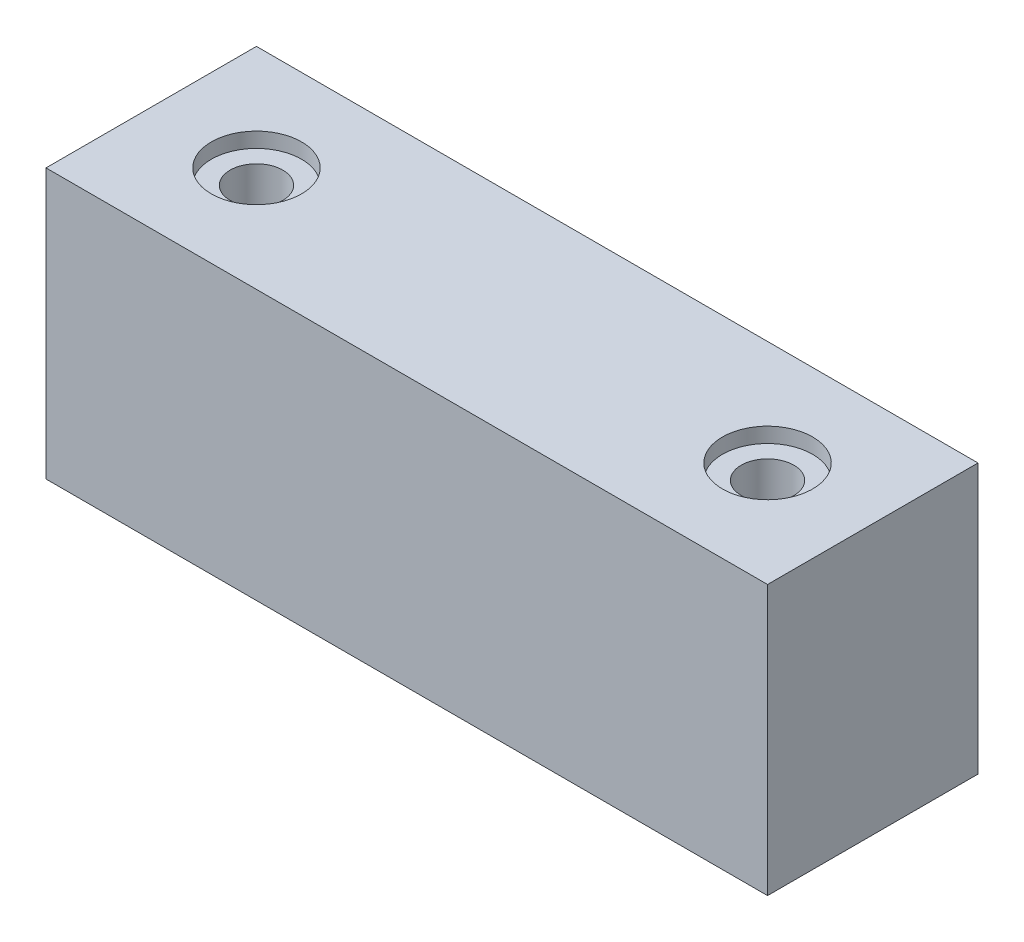
ISO-10303-21;
HEADER;
FILE_DESCRIPTION(('STEP AP214'),'2;1');
FILE_NAME('part.step','',(''),(''),'','','');
FILE_SCHEMA(('AUTOMOTIVE_DESIGN { 1 0 10303 214 1 1 1 1 }'));
ENDSEC;
DATA;
#1=APPLICATION_CONTEXT('core data for automotive mechanical design processes');
#2=APPLICATION_PROTOCOL_DEFINITION('international standard','automotive_design',2000,#1);
#3=PRODUCT_CONTEXT('',#1,'mechanical');
#4=PRODUCT('Part','Part','',(#3));
#5=PRODUCT_RELATED_PRODUCT_CATEGORY('part','',(#4));
#6=PRODUCT_DEFINITION_FORMATION('','',#4);
#7=PRODUCT_DEFINITION_CONTEXT('part definition',#1,'design');
#8=PRODUCT_DEFINITION('design','',#6,#7);
#9=PRODUCT_DEFINITION_SHAPE('','',#8);
#10=(LENGTH_UNIT() NAMED_UNIT(*) SI_UNIT(.MILLI.,.METRE.));
#11=(NAMED_UNIT(*) PLANE_ANGLE_UNIT() SI_UNIT($,.RADIAN.));
#12=(NAMED_UNIT(*) SI_UNIT($,.STERADIAN.) SOLID_ANGLE_UNIT());
#13=UNCERTAINTY_MEASURE_WITH_UNIT(LENGTH_MEASURE(1.E-05),#10,'distance_accuracy_value','');
#14=(GEOMETRIC_REPRESENTATION_CONTEXT(3) GLOBAL_UNCERTAINTY_ASSIGNED_CONTEXT((#13)) GLOBAL_UNIT_ASSIGNED_CONTEXT((#10,
#11,#12)) REPRESENTATION_CONTEXT('',''));
#15=CARTESIAN_POINT('',(0.,0.,0.));
#16=DIRECTION('',(0.,0.,1.));
#17=DIRECTION('',(1.,0.,0.));
#18=AXIS2_PLACEMENT_3D('',#15,#16,#17);
#19=CARTESIAN_POINT('',(-128.226206896552,-133.481379310345,88.9));
#20=DIRECTION('',(0.,1.,0.));
#21=DIRECTION('',(0.,0.,1.));
#22=AXIS2_PLACEMENT_3D('',#19,#20,#21);
#23=PLANE('',#22);
#24=CARTESIAN_POINT('',(-83.776206896552,-133.481379310345,44.45));
#25=DIRECTION('',(0.,1.,0.));
#26=DIRECTION('',(0.,0.,1.));
#27=AXIS2_PLACEMENT_3D('',#24,#25,#26);
#28=CIRCLE('',#27,11.1125);
#29=CARTESIAN_POINT('',(-83.776206896552,-133.481379310345,55.5625));
#30=VERTEX_POINT('',#29);
#31=EDGE_CURVE('E140',#30,#30,#28,.T.);
#32=ORIENTED_EDGE('',*,*,#31,.T.);
#33=EDGE_LOOP('',(#32));
#34=FACE_BOUND('',#33,.T.);
#35=CARTESIAN_POINT('',(132.123793103448,-133.481379310345,44.45));
#36=DIRECTION('',(0.,1.,0.));
#37=DIRECTION('',(0.,0.,-1.));
#38=AXIS2_PLACEMENT_3D('',#35,#36,#37);
#39=CIRCLE('',#38,11.1125);
#40=CARTESIAN_POINT('',(132.123793103448,-133.481379310345,55.5625));
#41=VERTEX_POINT('',#40);
#42=EDGE_CURVE('E143',#41,#41,#39,.T.);
#43=ORIENTED_EDGE('',*,*,#42,.T.);
#44=EDGE_LOOP('',(#43));
#45=FACE_BOUND('',#44,.T.);
#46=DIRECTION('',(1.,0.,0.));
#47=VECTOR('',#46,1.);
#48=CARTESIAN_POINT('',(-128.226206896552,-133.481379310345,0.));
#49=LINE('',#48,#47);
#50=CARTESIAN_POINT('',(-128.226206896552,-133.481379310345,0.));
#51=VERTEX_POINT('',#50);
#52=CARTESIAN_POINT('',(176.573793103448,-133.481379310345,0.));
#53=VERTEX_POINT('',#52);
#54=EDGE_CURVE('E101',#51,#53,#49,.T.);
#55=ORIENTED_EDGE('',*,*,#54,.T.);
#56=DIRECTION('',(0.,0.,-1.));
#57=VECTOR('',#56,1.);
#58=CARTESIAN_POINT('',(176.573793103448,-133.481379310345,88.9));
#59=LINE('',#58,#57);
#60=CARTESIAN_POINT('',(176.573793103448,-133.481379310345,88.9));
#61=VERTEX_POINT('',#60);
#62=EDGE_CURVE('E11',#61,#53,#59,.T.);
#63=ORIENTED_EDGE('',*,*,#62,.F.);
#64=DIRECTION('',(1.,0.,0.));
#65=VECTOR('',#64,1.);
#66=CARTESIAN_POINT('',(-128.226206896552,-133.481379310345,88.9));
#67=LINE('',#66,#65);
#68=CARTESIAN_POINT('',(-128.226206896552,-133.481379310345,88.9));
#69=VERTEX_POINT('',#68);
#70=EDGE_CURVE('E76',#69,#61,#67,.T.);
#71=ORIENTED_EDGE('',*,*,#70,.F.);
#72=DIRECTION('',(0.,0.,-1.));
#73=VECTOR('',#72,1.);
#74=CARTESIAN_POINT('',(-128.226206896552,-133.481379310345,88.9));
#75=LINE('',#74,#73);
#76=EDGE_CURVE('E100',#69,#51,#75,.T.);
#77=ORIENTED_EDGE('',*,*,#76,.T.);
#78=EDGE_LOOP('',(#55,#63,#71,#77));
#79=FACE_BOUND('',#78,.T.);
#80=ADVANCED_FACE('F39',(#34,#45,#79),#23,.F.);
#81=CARTESIAN_POINT('',(176.573793103448,-19.6504734474081,88.9));
#82=DIRECTION('',(1.,0.,0.));
#83=DIRECTION('',(0.,0.,-1.));
#84=AXIS2_PLACEMENT_3D('',#81,#82,#83);
#85=PLANE('',#84);
#86=DIRECTION('',(0.,-1.,0.));
#87=VECTOR('',#86,1.);
#88=CARTESIAN_POINT('',(176.573793103448,-19.6504734474081,0.));
#89=LINE('',#88,#87);
#90=CARTESIAN_POINT('',(176.573793103448,-19.6504734474081,0.));
#91=VERTEX_POINT('',#90);
#92=EDGE_CURVE('E87',#91,#53,#89,.T.);
#93=ORIENTED_EDGE('',*,*,#92,.F.);
#94=DIRECTION('',(0.,0.,-1.));
#95=VECTOR('',#94,1.);
#96=CARTESIAN_POINT('',(176.573793103448,-19.6504734474081,88.9));
#97=LINE('',#96,#95);
#98=CARTESIAN_POINT('',(176.573793103448,-19.6504734474081,88.9));
#99=VERTEX_POINT('',#98);
#100=EDGE_CURVE('E50',#99,#91,#97,.T.);
#101=ORIENTED_EDGE('',*,*,#100,.F.);
#102=DIRECTION('',(0.,-1.,0.));
#103=VECTOR('',#102,1.);
#104=CARTESIAN_POINT('',(176.573793103448,-19.6504734474081,88.9));
#105=LINE('',#104,#103);
#106=EDGE_CURVE('E83',#99,#61,#105,.T.);
#107=ORIENTED_EDGE('',*,*,#106,.T.);
#108=ORIENTED_EDGE('',*,*,#62,.T.);
#109=EDGE_LOOP('',(#93,#101,#107,#108));
#110=FACE_BOUND('',#109,.T.);
#111=ADVANCED_FACE('F81',(#110),#85,.T.);
#112=CARTESIAN_POINT('',(-128.226206896552,-19.6504734474081,88.9));
#113=DIRECTION('',(0.,1.,0.));
#114=DIRECTION('',(0.,0.,1.));
#115=AXIS2_PLACEMENT_3D('',#112,#113,#114);
#116=PLANE('',#115);
#117=CARTESIAN_POINT('',(-83.776206896552,-19.6504734474081,44.45));
#118=DIRECTION('',(0.,1.,0.));
#119=DIRECTION('',(0.,0.,1.));
#120=AXIS2_PLACEMENT_3D('',#117,#118,#119);
#121=CIRCLE('',#120,19.05);
#122=CARTESIAN_POINT('',(-83.776206896552,-19.6504734474081,63.5));
#123=VERTEX_POINT('',#122);
#124=EDGE_CURVE('E155',#123,#123,#121,.T.);
#125=ORIENTED_EDGE('',*,*,#124,.F.);
#126=EDGE_LOOP('',(#125));
#127=FACE_BOUND('',#126,.T.);
#128=CARTESIAN_POINT('',(132.123793103448,-19.6504734474081,44.45));
#129=DIRECTION('',(0.,1.,0.));
#130=DIRECTION('',(0.,0.,-1.));
#131=AXIS2_PLACEMENT_3D('',#128,#129,#130);
#132=CIRCLE('',#131,19.05);
#133=CARTESIAN_POINT('',(132.123793103448,-19.6504734474081,25.4));
#134=VERTEX_POINT('',#133);
#135=EDGE_CURVE('E154',#134,#134,#132,.T.);
#136=ORIENTED_EDGE('',*,*,#135,.F.);
#137=EDGE_LOOP('',(#136));
#138=FACE_BOUND('',#137,.T.);
#139=DIRECTION('',(1.,0.,0.));
#140=VECTOR('',#139,1.);
#141=CARTESIAN_POINT('',(-128.226206896552,-19.6504734474081,0.));
#142=LINE('',#141,#140);
#143=CARTESIAN_POINT('',(-128.226206896552,-19.6504734474081,0.));
#144=VERTEX_POINT('',#143);
#145=EDGE_CURVE('E106',#144,#91,#142,.T.);
#146=ORIENTED_EDGE('',*,*,#145,.F.);
#147=DIRECTION('',(0.,0.,-1.));
#148=VECTOR('',#147,1.);
#149=CARTESIAN_POINT('',(-128.226206896552,-19.6504734474081,88.9));
#150=LINE('',#149,#148);
#151=CARTESIAN_POINT('',(-128.226206896552,-19.6504734474081,88.9));
#152=VERTEX_POINT('',#151);
#153=EDGE_CURVE('E68',#152,#144,#150,.T.);
#154=ORIENTED_EDGE('',*,*,#153,.F.);
#155=DIRECTION('',(1.,0.,0.));
#156=VECTOR('',#155,1.);
#157=CARTESIAN_POINT('',(-128.226206896552,-19.6504734474081,88.9));
#158=LINE('',#157,#156);
#159=EDGE_CURVE('E91',#152,#99,#158,.T.);
#160=ORIENTED_EDGE('',*,*,#159,.T.);
#161=ORIENTED_EDGE('',*,*,#100,.T.);
#162=EDGE_LOOP('',(#146,#154,#160,#161));
#163=FACE_BOUND('',#162,.T.);
#164=ADVANCED_FACE('F92',(#127,#138,#163),#116,.T.);
#165=CARTESIAN_POINT('',(-128.226206896552,-19.6504734474081,88.9));
#166=DIRECTION('',(1.,0.,0.));
#167=DIRECTION('',(0.,1.,0.));
#168=AXIS2_PLACEMENT_3D('',#165,#166,#167);
#169=PLANE('',#168);
#170=DIRECTION('',(0.,-1.,0.));
#171=VECTOR('',#170,1.);
#172=CARTESIAN_POINT('',(-128.226206896552,-19.6504734474081,0.));
#173=LINE('',#172,#171);
#174=EDGE_CURVE('E71',#144,#51,#173,.T.);
#175=ORIENTED_EDGE('',*,*,#174,.T.);
#176=ORIENTED_EDGE('',*,*,#76,.F.);
#177=DIRECTION('',(0.,-1.,0.));
#178=VECTOR('',#177,1.);
#179=CARTESIAN_POINT('',(-128.226206896552,-19.6504734474081,88.9));
#180=LINE('',#179,#178);
#181=EDGE_CURVE('E54',#152,#69,#180,.T.);
#182=ORIENTED_EDGE('',*,*,#181,.F.);
#183=ORIENTED_EDGE('',*,*,#153,.T.);
#184=EDGE_LOOP('',(#175,#176,#182,#183));
#185=FACE_BOUND('',#184,.T.);
#186=ADVANCED_FACE('F123',(#185),#169,.F.);
#187=CARTESIAN_POINT('',(0.,0.,88.9));
#188=DIRECTION('',(0.,0.,-1.));
#189=DIRECTION('',(-1.,0.,0.));
#190=AXIS2_PLACEMENT_3D('',#187,#188,#189);
#191=PLANE('',#190);
#192=ORIENTED_EDGE('',*,*,#70,.T.);
#193=ORIENTED_EDGE('',*,*,#106,.F.);
#194=ORIENTED_EDGE('',*,*,#159,.F.);
#195=ORIENTED_EDGE('',*,*,#181,.T.);
#196=EDGE_LOOP('',(#192,#193,#194,#195));
#197=FACE_BOUND('',#196,.T.);
#198=ADVANCED_FACE('F95',(#197),#191,.F.);
#199=CARTESIAN_POINT('',(0.,0.,0.));
#200=DIRECTION('',(0.,0.,-1.));
#201=DIRECTION('',(-1.,0.,0.));
#202=AXIS2_PLACEMENT_3D('',#199,#200,#201);
#203=PLANE('',#202);
#204=ORIENTED_EDGE('',*,*,#54,.F.);
#205=ORIENTED_EDGE('',*,*,#174,.F.);
#206=ORIENTED_EDGE('',*,*,#145,.T.);
#207=ORIENTED_EDGE('',*,*,#92,.T.);
#208=EDGE_LOOP('',(#204,#205,#206,#207));
#209=FACE_BOUND('',#208,.T.);
#210=ADVANCED_FACE('F114',(#209),#203,.T.);
#211=CARTESIAN_POINT('',(132.123793103448,-26.0004734474081,44.45));
#212=DIRECTION('',(0.,1.,0.));
#213=DIRECTION('',(0.,0.,1.));
#214=AXIS2_PLACEMENT_3D('',#211,#212,#213);
#215=CYLINDRICAL_SURFACE('',#214,19.05);
#216=CARTESIAN_POINT('',(132.123793103448,-26.0004734474081,44.45));
#217=DIRECTION('',(0.,1.,0.));
#218=DIRECTION('',(0.,0.,-1.));
#219=AXIS2_PLACEMENT_3D('',#216,#217,#218);
#220=CIRCLE('',#219,19.05);
#221=CARTESIAN_POINT('',(132.123793103448,-26.0004734474081,25.4));
#222=VERTEX_POINT('',#221);
#223=EDGE_CURVE('E158',#222,#222,#220,.T.);
#224=ORIENTED_EDGE('',*,*,#223,.F.);
#225=EDGE_LOOP('',(#224));
#226=FACE_BOUND('',#225,.T.);
#227=ORIENTED_EDGE('',*,*,#135,.T.);
#228=EDGE_LOOP('',(#227));
#229=FACE_BOUND('',#228,.T.);
#230=ADVANCED_FACE('F113',(#226,#229),#215,.F.);
#231=CARTESIAN_POINT('',(132.123793103448,-26.0004734474081,44.45));
#232=DIRECTION('',(0.,-1.,0.));
#233=DIRECTION('',(0.,0.,-1.));
#234=AXIS2_PLACEMENT_3D('',#231,#232,#233);
#235=PLANE('',#234);
#236=CARTESIAN_POINT('',(132.123793103448,-26.0004734474081,44.45));
#237=DIRECTION('',(0.,1.,0.));
#238=DIRECTION('',(0.,0.,-1.));
#239=AXIS2_PLACEMENT_3D('',#236,#237,#238);
#240=CIRCLE('',#239,11.1125);
#241=CARTESIAN_POINT('',(132.123793103448,-26.0004734474081,55.5625));
#242=VERTEX_POINT('',#241);
#243=EDGE_CURVE('E141',#242,#242,#240,.T.);
#244=ORIENTED_EDGE('',*,*,#243,.F.);
#245=EDGE_LOOP('',(#244));
#246=FACE_BOUND('',#245,.T.);
#247=ORIENTED_EDGE('',*,*,#223,.T.);
#248=EDGE_LOOP('',(#247));
#249=FACE_BOUND('',#248,.T.);
#250=ADVANCED_FACE('F124',(#246,#249),#235,.F.);
#251=CARTESIAN_POINT('',(-83.776206896552,-26.0004734474081,44.45));
#252=DIRECTION('',(0.,1.,0.));
#253=DIRECTION('',(0.,0.,1.));
#254=AXIS2_PLACEMENT_3D('',#251,#252,#253);
#255=CYLINDRICAL_SURFACE('',#254,19.05);
#256=CARTESIAN_POINT('',(-83.776206896552,-26.0004734474081,44.45));
#257=DIRECTION('',(0.,1.,0.));
#258=DIRECTION('',(0.,0.,1.));
#259=AXIS2_PLACEMENT_3D('',#256,#257,#258);
#260=CIRCLE('',#259,19.05);
#261=CARTESIAN_POINT('',(-83.776206896552,-26.0004734474081,63.5));
#262=VERTEX_POINT('',#261);
#263=EDGE_CURVE('E102',#262,#262,#260,.T.);
#264=ORIENTED_EDGE('',*,*,#263,.F.);
#265=EDGE_LOOP('',(#264));
#266=FACE_BOUND('',#265,.T.);
#267=ORIENTED_EDGE('',*,*,#124,.T.);
#268=EDGE_LOOP('',(#267));
#269=FACE_BOUND('',#268,.T.);
#270=ADVANCED_FACE('F175',(#266,#269),#255,.F.);
#271=CARTESIAN_POINT('',(-83.776206896552,-26.0004734474081,44.45));
#272=DIRECTION('',(0.,1.,0.));
#273=DIRECTION('',(0.,0.,1.));
#274=AXIS2_PLACEMENT_3D('',#271,#272,#273);
#275=PLANE('',#274);
#276=CARTESIAN_POINT('',(-83.776206896552,-26.0004734474081,44.45));
#277=DIRECTION('',(0.,1.,0.));
#278=DIRECTION('',(0.,0.,1.));
#279=AXIS2_PLACEMENT_3D('',#276,#277,#278);
#280=CIRCLE('',#279,11.1125);
#281=CARTESIAN_POINT('',(-83.776206896552,-26.0004734474081,55.5625));
#282=VERTEX_POINT('',#281);
#283=EDGE_CURVE('E148',#282,#282,#280,.T.);
#284=ORIENTED_EDGE('',*,*,#283,.F.);
#285=EDGE_LOOP('',(#284));
#286=FACE_BOUND('',#285,.T.);
#287=ORIENTED_EDGE('',*,*,#263,.T.);
#288=EDGE_LOOP('',(#287));
#289=FACE_BOUND('',#288,.T.);
#290=ADVANCED_FACE('F169',(#286,#289),#275,.T.);
#291=CARTESIAN_POINT('',(132.123793103448,-133.481379310345,44.45));
#292=DIRECTION('',(0.,1.,0.));
#293=DIRECTION('',(0.,0.,1.));
#294=AXIS2_PLACEMENT_3D('',#291,#292,#293);
#295=CYLINDRICAL_SURFACE('',#294,11.1125);
#296=CARTESIAN_POINT('',(132.123793103448,-133.481379310345,55.5625));
#297=CARTESIAN_POINT('',(132.123793103448,-132.361786540939,55.5625));
#298=CARTESIAN_POINT('',(132.123793103448,-131.242193771534,55.5625));
#299=CARTESIAN_POINT('',(132.123793103448,-129.003008232722,55.5625));
#300=CARTESIAN_POINT('',(132.123793103448,-127.883415463317,55.5625));
#301=CARTESIAN_POINT('',(132.123793103448,-125.644229924506,55.5625));
#302=CARTESIAN_POINT('',(132.123793103448,-124.5246371551,55.5625));
#303=CARTESIAN_POINT('',(132.123793103448,-122.285451616289,55.5625));
#304=CARTESIAN_POINT('',(132.123793103448,-121.165858846883,55.5625));
#305=CARTESIAN_POINT('',(132.123793103448,-118.926673308072,55.5625));
#306=CARTESIAN_POINT('',(132.123793103448,-117.807080538667,55.5625));
#307=CARTESIAN_POINT('',(132.123793103448,-115.567894999855,55.5625));
#308=CARTESIAN_POINT('',(132.123793103448,-114.44830223045,55.5625));
#309=CARTESIAN_POINT('',(132.123793103448,-112.209116691639,55.5625));
#310=CARTESIAN_POINT('',(132.123793103448,-111.089523922233,55.5625));
#311=CARTESIAN_POINT('',(132.123793103448,-108.850338383422,55.5625));
#312=CARTESIAN_POINT('',(132.123793103448,-107.730745614016,55.5625));
#313=CARTESIAN_POINT('',(132.123793103448,-105.491560075205,55.5625));
#314=CARTESIAN_POINT('',(132.123793103448,-104.371967305799,55.5625));
#315=CARTESIAN_POINT('',(132.123793103448,-102.132781766988,55.5625));
#316=CARTESIAN_POINT('',(132.123793103448,-101.013188997583,55.5625));
#317=CARTESIAN_POINT('',(132.123793103448,-98.7740034587715,55.5625));
#318=CARTESIAN_POINT('',(132.123793103448,-97.6544106893659,55.5625));
#319=CARTESIAN_POINT('',(132.123793103448,-95.4152251505547,55.5625));
#320=CARTESIAN_POINT('',(132.123793103448,-94.2956323811491,55.5625));
#321=CARTESIAN_POINT('',(132.123793103448,-92.056446842338,55.5625));
#322=CARTESIAN_POINT('',(132.123793103448,-90.9368540729324,55.5625));
#323=CARTESIAN_POINT('',(132.123793103448,-88.6976685341212,55.5625));
#324=CARTESIAN_POINT('',(132.123793103448,-87.5780757647156,55.5625));
#325=CARTESIAN_POINT('',(132.123793103448,-85.3388902259044,55.5625));
#326=CARTESIAN_POINT('',(132.123793103448,-84.2192974564988,55.5625));
#327=CARTESIAN_POINT('',(132.123793103448,-81.9801119176877,55.5625));
#328=CARTESIAN_POINT('',(132.123793103448,-80.8605191482821,55.5625));
#329=CARTESIAN_POINT('',(132.123793103448,-78.6213336094709,55.5625));
#330=CARTESIAN_POINT('',(132.123793103448,-77.5017408400653,55.5625));
#331=CARTESIAN_POINT('',(132.123793103448,-75.2625553012541,55.5625));
#332=CARTESIAN_POINT('',(132.123793103448,-74.1429625318485,55.5625));
#333=CARTESIAN_POINT('',(132.123793103448,-71.9037769930374,55.5625));
#334=CARTESIAN_POINT('',(132.123793103448,-70.7841842236318,55.5625));
#335=CARTESIAN_POINT('',(132.123793103448,-68.5449986848206,55.5625));
#336=CARTESIAN_POINT('',(132.123793103448,-67.425405915415,55.5625));
#337=CARTESIAN_POINT('',(132.123793103448,-65.1862203766038,55.5625));
#338=CARTESIAN_POINT('',(132.123793103448,-64.0666276071982,55.5625));
#339=CARTESIAN_POINT('',(132.123793103448,-61.827442068387,55.5625));
#340=CARTESIAN_POINT('',(132.123793103448,-60.7078492989815,55.5625));
#341=CARTESIAN_POINT('',(132.123793103448,-58.4686637601703,55.5625));
#342=CARTESIAN_POINT('',(132.123793103448,-57.3490709907647,55.5625));
#343=CARTESIAN_POINT('',(132.123793103448,-55.1098854519535,55.5625));
#344=CARTESIAN_POINT('',(132.123793103448,-53.9902926825479,55.5625));
#345=CARTESIAN_POINT('',(132.123793103448,-51.7511071437367,55.5625));
#346=CARTESIAN_POINT('',(132.123793103448,-50.6315143743311,55.5625));
#347=CARTESIAN_POINT('',(132.123793103448,-48.3923288355199,55.5625));
#348=CARTESIAN_POINT('',(132.123793103448,-47.2727360661144,55.5625));
#349=CARTESIAN_POINT('',(132.123793103448,-45.0335505273032,55.5625));
#350=CARTESIAN_POINT('',(132.123793103448,-43.9139577578976,55.5625));
#351=CARTESIAN_POINT('',(132.123793103448,-41.6747722190864,55.5625));
#352=CARTESIAN_POINT('',(132.123793103448,-40.5551794496808,55.5625));
#353=CARTESIAN_POINT('',(132.123793103448,-38.3159939108696,55.5625));
#354=CARTESIAN_POINT('',(132.123793103448,-37.196401141464,55.5625));
#355=CARTESIAN_POINT('',(132.123793103448,-34.9572156026529,55.5625));
#356=CARTESIAN_POINT('',(132.123793103448,-33.8376228332473,55.5625));
#357=CARTESIAN_POINT('',(132.123793103448,-31.5984372944361,55.5625));
#358=CARTESIAN_POINT('',(132.123793103448,-30.4788445250305,55.5625));
#359=CARTESIAN_POINT('',(132.123793103448,-28.2396589862193,55.5625));
#360=CARTESIAN_POINT('',(132.123793103448,-27.1200662168137,55.5625));
#361=CARTESIAN_POINT('',(132.123793103448,-26.0004734474081,55.5625));
#362=B_SPLINE_CURVE_WITH_KNOTS('',3,(#296,#297,#298,#299,#300,#301,#302,#303,#304,#305,#306,
#307,#308,#309,#310,#311,#312,#313,#314,#315,#316,#317,#318,#319,#320,#321,#322,#323,#324,#325,
#326,#327,#328,#329,#330,#331,#332,#333,#334,#335,#336,#337,#338,#339,#340,#341,#342,#343,#344,
#345,#346,#347,#348,#349,#350,#351,#352,#353,#354,#355,#356,#357,#358,#359,#360,#361),
.UNSPECIFIED.,.F.,.F.,(4,2,2,2,2,2,2,2,2,2,2,2,2,2,2,2,2,2,2,2,2,2,2,2,2,2,2,2,2,2,2,2,4),(0.,
3.35877830821676,6.71755661643353,10.0763349246503,13.4351132328671,16.7938915410838,
20.1526698493006,23.5114481575174,26.8702264657341,30.2290047739509,33.5877830821677,
36.9465613903845,40.3053396986012,43.664118006818,47.0228963150348,50.3816746232515,
53.7404529314683,57.0992312396851,60.4580095479019,63.8167878561186,67.1755661643354,
70.5343444725522,73.8931227807689,77.2519010889857,80.6106793972025,83.9694577054192,
87.328236013636,90.6870143218528,94.0457926300696,97.4045709382863,100.763349246503,
104.12212755472,107.480905862937),.UNSPECIFIED.);
#363=EDGE_CURVE('BSEAM173',#41,#242,#362,.T.);
#364=ORIENTED_EDGE('',*,*,#42,.F.);
#365=ORIENTED_EDGE('',*,*,#243,.T.);
#366=ORIENTED_EDGE('',*,*,#363,.T.);
#367=ORIENTED_EDGE('',*,*,#363,.F.);
#368=EDGE_LOOP('',(#364,#366,#365,#367));
#369=FACE_BOUND('',#368,.T.);
#370=ADVANCED_FACE('F173',(#369),#295,.F.);
#371=CARTESIAN_POINT('',(-83.776206896552,-133.481379310345,44.45));
#372=DIRECTION('',(0.,1.,0.));
#373=DIRECTION('',(0.,0.,1.));
#374=AXIS2_PLACEMENT_3D('',#371,#372,#373);
#375=CYLINDRICAL_SURFACE('',#374,11.1125);
#376=CARTESIAN_POINT('',(-83.776206896552,-133.481379310345,55.5625));
#377=CARTESIAN_POINT('',(-83.776206896552,-132.361786540939,55.5625));
#378=CARTESIAN_POINT('',(-83.776206896552,-131.242193771534,55.5625));
#379=CARTESIAN_POINT('',(-83.776206896552,-129.003008232722,55.5625));
#380=CARTESIAN_POINT('',(-83.776206896552,-127.883415463317,55.5625));
#381=CARTESIAN_POINT('',(-83.776206896552,-125.644229924506,55.5625));
#382=CARTESIAN_POINT('',(-83.776206896552,-124.5246371551,55.5625));
#383=CARTESIAN_POINT('',(-83.776206896552,-122.285451616289,55.5625));
#384=CARTESIAN_POINT('',(-83.776206896552,-121.165858846883,55.5625));
#385=CARTESIAN_POINT('',(-83.776206896552,-118.926673308072,55.5625));
#386=CARTESIAN_POINT('',(-83.776206896552,-117.807080538667,55.5625));
#387=CARTESIAN_POINT('',(-83.776206896552,-115.567894999855,55.5625));
#388=CARTESIAN_POINT('',(-83.776206896552,-114.44830223045,55.5625));
#389=CARTESIAN_POINT('',(-83.776206896552,-112.209116691639,55.5625));
#390=CARTESIAN_POINT('',(-83.776206896552,-111.089523922233,55.5625));
#391=CARTESIAN_POINT('',(-83.776206896552,-108.850338383422,55.5625));
#392=CARTESIAN_POINT('',(-83.776206896552,-107.730745614016,55.5625));
#393=CARTESIAN_POINT('',(-83.776206896552,-105.491560075205,55.5625));
#394=CARTESIAN_POINT('',(-83.776206896552,-104.371967305799,55.5625));
#395=CARTESIAN_POINT('',(-83.776206896552,-102.132781766988,55.5625));
#396=CARTESIAN_POINT('',(-83.776206896552,-101.013188997583,55.5625));
#397=CARTESIAN_POINT('',(-83.776206896552,-98.7740034587715,55.5625));
#398=CARTESIAN_POINT('',(-83.776206896552,-97.6544106893659,55.5625));
#399=CARTESIAN_POINT('',(-83.776206896552,-95.4152251505547,55.5625));
#400=CARTESIAN_POINT('',(-83.776206896552,-94.2956323811491,55.5625));
#401=CARTESIAN_POINT('',(-83.776206896552,-92.056446842338,55.5625));
#402=CARTESIAN_POINT('',(-83.776206896552,-90.9368540729324,55.5625));
#403=CARTESIAN_POINT('',(-83.776206896552,-88.6976685341212,55.5625));
#404=CARTESIAN_POINT('',(-83.776206896552,-87.5780757647156,55.5625));
#405=CARTESIAN_POINT('',(-83.776206896552,-85.3388902259044,55.5625));
#406=CARTESIAN_POINT('',(-83.776206896552,-84.2192974564988,55.5625));
#407=CARTESIAN_POINT('',(-83.776206896552,-81.9801119176877,55.5625));
#408=CARTESIAN_POINT('',(-83.776206896552,-80.8605191482821,55.5625));
#409=CARTESIAN_POINT('',(-83.776206896552,-78.6213336094709,55.5625));
#410=CARTESIAN_POINT('',(-83.776206896552,-77.5017408400653,55.5625));
#411=CARTESIAN_POINT('',(-83.776206896552,-75.2625553012541,55.5625));
#412=CARTESIAN_POINT('',(-83.776206896552,-74.1429625318485,55.5625));
#413=CARTESIAN_POINT('',(-83.776206896552,-71.9037769930374,55.5625));
#414=CARTESIAN_POINT('',(-83.776206896552,-70.7841842236318,55.5625));
#415=CARTESIAN_POINT('',(-83.776206896552,-68.5449986848206,55.5625));
#416=CARTESIAN_POINT('',(-83.776206896552,-67.425405915415,55.5625));
#417=CARTESIAN_POINT('',(-83.776206896552,-65.1862203766038,55.5625));
#418=CARTESIAN_POINT('',(-83.776206896552,-64.0666276071982,55.5625));
#419=CARTESIAN_POINT('',(-83.776206896552,-61.827442068387,55.5625));
#420=CARTESIAN_POINT('',(-83.776206896552,-60.7078492989815,55.5625));
#421=CARTESIAN_POINT('',(-83.776206896552,-58.4686637601703,55.5625));
#422=CARTESIAN_POINT('',(-83.776206896552,-57.3490709907647,55.5625));
#423=CARTESIAN_POINT('',(-83.776206896552,-55.1098854519535,55.5625));
#424=CARTESIAN_POINT('',(-83.776206896552,-53.9902926825479,55.5625));
#425=CARTESIAN_POINT('',(-83.776206896552,-51.7511071437367,55.5625));
#426=CARTESIAN_POINT('',(-83.776206896552,-50.6315143743311,55.5625));
#427=CARTESIAN_POINT('',(-83.776206896552,-48.3923288355199,55.5625));
#428=CARTESIAN_POINT('',(-83.776206896552,-47.2727360661144,55.5625));
#429=CARTESIAN_POINT('',(-83.776206896552,-45.0335505273032,55.5625));
#430=CARTESIAN_POINT('',(-83.776206896552,-43.9139577578976,55.5625));
#431=CARTESIAN_POINT('',(-83.776206896552,-41.6747722190864,55.5625));
#432=CARTESIAN_POINT('',(-83.776206896552,-40.5551794496808,55.5625));
#433=CARTESIAN_POINT('',(-83.776206896552,-38.3159939108696,55.5625));
#434=CARTESIAN_POINT('',(-83.776206896552,-37.196401141464,55.5625));
#435=CARTESIAN_POINT('',(-83.776206896552,-34.9572156026529,55.5625));
#436=CARTESIAN_POINT('',(-83.776206896552,-33.8376228332473,55.5625));
#437=CARTESIAN_POINT('',(-83.776206896552,-31.5984372944361,55.5625));
#438=CARTESIAN_POINT('',(-83.776206896552,-30.4788445250305,55.5625));
#439=CARTESIAN_POINT('',(-83.776206896552,-28.2396589862193,55.5625));
#440=CARTESIAN_POINT('',(-83.776206896552,-27.1200662168137,55.5625));
#441=CARTESIAN_POINT('',(-83.776206896552,-26.0004734474081,55.5625));
#442=B_SPLINE_CURVE_WITH_KNOTS('',3,(#376,#377,#378,#379,#380,#381,#382,#383,#384,#385,#386,
#387,#388,#389,#390,#391,#392,#393,#394,#395,#396,#397,#398,#399,#400,#401,#402,#403,#404,#405,
#406,#407,#408,#409,#410,#411,#412,#413,#414,#415,#416,#417,#418,#419,#420,#421,#422,#423,#424,
#425,#426,#427,#428,#429,#430,#431,#432,#433,#434,#435,#436,#437,#438,#439,#440,#441),
.UNSPECIFIED.,.F.,.F.,(4,2,2,2,2,2,2,2,2,2,2,2,2,2,2,2,2,2,2,2,2,2,2,2,2,2,2,2,2,2,2,2,4),(0.,
3.35877830821676,6.71755661643353,10.0763349246503,13.4351132328671,16.7938915410838,
20.1526698493006,23.5114481575174,26.8702264657341,30.2290047739509,33.5877830821677,
36.9465613903845,40.3053396986012,43.664118006818,47.0228963150348,50.3816746232515,
53.7404529314683,57.0992312396851,60.4580095479019,63.8167878561186,67.1755661643354,
70.5343444725522,73.8931227807689,77.2519010889857,80.6106793972025,83.9694577054192,
87.328236013636,90.6870143218528,94.0457926300696,97.4045709382863,100.763349246503,
104.12212755472,107.480905862937),.UNSPECIFIED.);
#443=EDGE_CURVE('BSEAM167',#30,#282,#442,.T.);
#444=ORIENTED_EDGE('',*,*,#31,.F.);
#445=ORIENTED_EDGE('',*,*,#283,.T.);
#446=ORIENTED_EDGE('',*,*,#443,.T.);
#447=ORIENTED_EDGE('',*,*,#443,.F.);
#448=EDGE_LOOP('',(#444,#446,#445,#447));
#449=FACE_BOUND('',#448,.T.);
#450=ADVANCED_FACE('F167',(#449),#375,.F.);
#451=CLOSED_SHELL('',(#80,#111,#164,#186,#198,#210,#230,#250,#270,#290,#370,#450));
#452=MANIFOLD_SOLID_BREP('B2',#451);
#453=ADVANCED_BREP_SHAPE_REPRESENTATION('',(#18,#452),#14);
#454=SHAPE_DEFINITION_REPRESENTATION(#9,#453);
ENDSEC;
END-ISO-10303-21;
